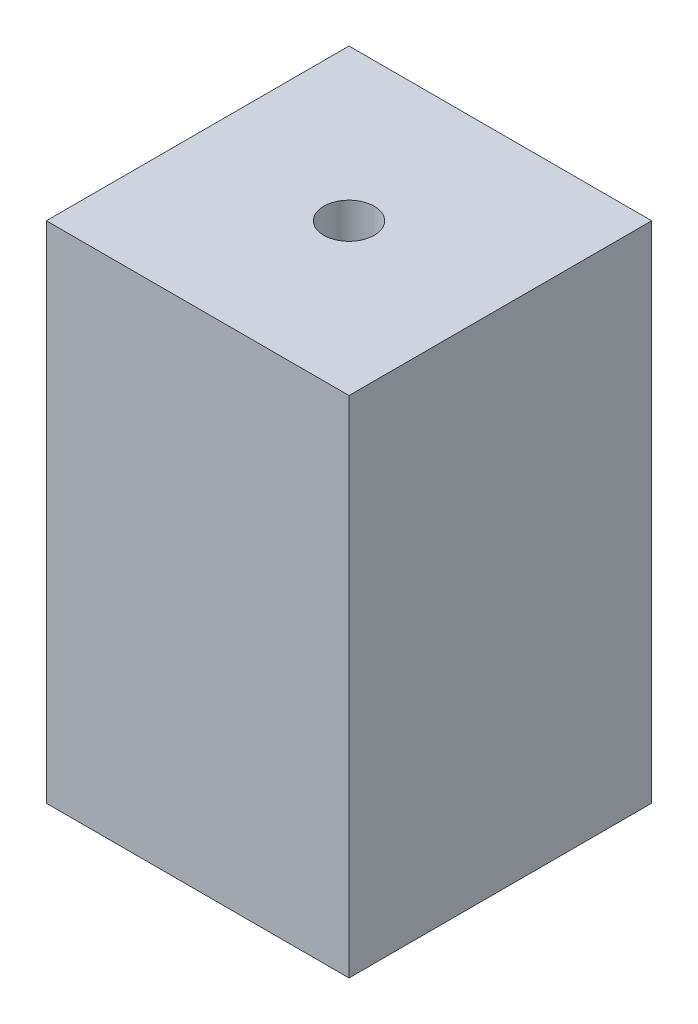
ISO-10303-21;
HEADER;
FILE_DESCRIPTION(('STEP AP214'),'2;1');
FILE_NAME('part.step','',(''),(''),'','','');
FILE_SCHEMA(('AUTOMOTIVE_DESIGN { 1 0 10303 214 1 1 1 1 }'));
ENDSEC;
DATA;
#1=APPLICATION_CONTEXT('core data for automotive mechanical design processes');
#2=APPLICATION_PROTOCOL_DEFINITION('international standard','automotive_design',2000,#1);
#3=PRODUCT_CONTEXT('',#1,'mechanical');
#4=PRODUCT('Part','Part','',(#3));
#5=PRODUCT_RELATED_PRODUCT_CATEGORY('part','',(#4));
#6=PRODUCT_DEFINITION_FORMATION('','',#4);
#7=PRODUCT_DEFINITION_CONTEXT('part definition',#1,'design');
#8=PRODUCT_DEFINITION('design','',#6,#7);
#9=PRODUCT_DEFINITION_SHAPE('','',#8);
#10=(LENGTH_UNIT() NAMED_UNIT(*) SI_UNIT(.MILLI.,.METRE.));
#11=(NAMED_UNIT(*) PLANE_ANGLE_UNIT() SI_UNIT($,.RADIAN.));
#12=(NAMED_UNIT(*) SI_UNIT($,.STERADIAN.) SOLID_ANGLE_UNIT());
#13=UNCERTAINTY_MEASURE_WITH_UNIT(LENGTH_MEASURE(1.E-05),#10,'distance_accuracy_value','');
#14=(GEOMETRIC_REPRESENTATION_CONTEXT(3) GLOBAL_UNCERTAINTY_ASSIGNED_CONTEXT((#13)) GLOBAL_UNIT_ASSIGNED_CONTEXT((#10,
#11,#12)) REPRESENTATION_CONTEXT('',''));
#15=CARTESIAN_POINT('',(0.,0.,0.));
#16=DIRECTION('',(0.,0.,1.));
#17=DIRECTION('',(1.,0.,0.));
#18=AXIS2_PLACEMENT_3D('',#15,#16,#17);
#19=CARTESIAN_POINT('',(15.,50.,-15.));
#20=DIRECTION('',(-1.,0.,0.));
#21=DIRECTION('',(0.,0.,1.));
#22=AXIS2_PLACEMENT_3D('',#19,#20,#21);
#23=PLANE('',#22);
#24=DIRECTION('',(0.,0.,-1.));
#25=VECTOR('',#24,1.);
#26=CARTESIAN_POINT('',(15.,0.,-15.));
#27=LINE('',#26,#25);
#28=CARTESIAN_POINT('',(15.,0.,15.));
#29=VERTEX_POINT('',#28);
#30=CARTESIAN_POINT('',(15.,0.,-15.));
#31=VERTEX_POINT('',#30);
#32=EDGE_CURVE('E107',#29,#31,#27,.T.);
#33=ORIENTED_EDGE('',*,*,#32,.T.);
#34=DIRECTION('',(0.,-1.,0.));
#35=VECTOR('',#34,1.);
#36=CARTESIAN_POINT('',(15.,50.,-15.));
#37=LINE('',#36,#35);
#38=CARTESIAN_POINT('',(15.,50.,-15.));
#39=VERTEX_POINT('',#38);
#40=EDGE_CURVE('E11',#39,#31,#37,.T.);
#41=ORIENTED_EDGE('',*,*,#40,.F.);
#42=DIRECTION('',(0.,0.,-1.));
#43=VECTOR('',#42,1.);
#44=CARTESIAN_POINT('',(15.,50.,-15.));
#45=LINE('',#44,#43);
#46=CARTESIAN_POINT('',(15.,50.,15.));
#47=VERTEX_POINT('',#46);
#48=EDGE_CURVE('E91',#47,#39,#45,.T.);
#49=ORIENTED_EDGE('',*,*,#48,.F.);
#50=DIRECTION('',(0.,-1.,0.));
#51=VECTOR('',#50,1.);
#52=CARTESIAN_POINT('',(15.,50.,15.));
#53=LINE('',#52,#51);
#54=EDGE_CURVE('E103',#47,#29,#53,.T.);
#55=ORIENTED_EDGE('',*,*,#54,.T.);
#56=EDGE_LOOP('',(#33,#41,#49,#55));
#57=FACE_BOUND('',#56,.T.);
#58=ADVANCED_FACE('F39',(#57),#23,.F.);
#59=CARTESIAN_POINT('',(-15.,50.,-15.));
#60=DIRECTION('',(0.,0.,1.));
#61=DIRECTION('',(1.,0.,0.));
#62=AXIS2_PLACEMENT_3D('',#59,#60,#61);
#63=PLANE('',#62);
#64=DIRECTION('',(-1.,0.,0.));
#65=VECTOR('',#64,1.);
#66=CARTESIAN_POINT('',(-15.,0.,-15.));
#67=LINE('',#66,#65);
#68=CARTESIAN_POINT('',(-15.,0.,-15.));
#69=VERTEX_POINT('',#68);
#70=EDGE_CURVE('E96',#31,#69,#67,.T.);
#71=ORIENTED_EDGE('',*,*,#70,.T.);
#72=DIRECTION('',(0.,-1.,0.));
#73=VECTOR('',#72,1.);
#74=CARTESIAN_POINT('',(-15.,50.,-15.));
#75=LINE('',#74,#73);
#76=CARTESIAN_POINT('',(-15.,50.,-15.));
#77=VERTEX_POINT('',#76);
#78=EDGE_CURVE('E48',#77,#69,#75,.T.);
#79=ORIENTED_EDGE('',*,*,#78,.F.);
#80=DIRECTION('',(-1.,0.,0.));
#81=VECTOR('',#80,1.);
#82=CARTESIAN_POINT('',(-15.,50.,-15.));
#83=LINE('',#82,#81);
#84=EDGE_CURVE('E86',#39,#77,#83,.T.);
#85=ORIENTED_EDGE('',*,*,#84,.F.);
#86=ORIENTED_EDGE('',*,*,#40,.T.);
#87=EDGE_LOOP('',(#71,#79,#85,#86));
#88=FACE_BOUND('',#87,.T.);
#89=ADVANCED_FACE('F95',(#88),#63,.F.);
#90=CARTESIAN_POINT('',(-15.,50.,-15.));
#91=DIRECTION('',(1.,0.,0.));
#92=DIRECTION('',(0.,0.,-1.));
#93=AXIS2_PLACEMENT_3D('',#90,#91,#92);
#94=PLANE('',#93);
#95=DIRECTION('',(0.,0.,1.));
#96=VECTOR('',#95,1.);
#97=CARTESIAN_POINT('',(-15.,0.,-15.));
#98=LINE('',#97,#96);
#99=CARTESIAN_POINT('',(-15.,0.,15.));
#100=VERTEX_POINT('',#99);
#101=EDGE_CURVE('E73',#69,#100,#98,.T.);
#102=ORIENTED_EDGE('',*,*,#101,.T.);
#103=DIRECTION('',(0.,-1.,0.));
#104=VECTOR('',#103,1.);
#105=CARTESIAN_POINT('',(-15.,50.,15.));
#106=LINE('',#105,#104);
#107=CARTESIAN_POINT('',(-15.,50.,15.));
#108=VERTEX_POINT('',#107);
#109=EDGE_CURVE('E98',#108,#100,#106,.T.);
#110=ORIENTED_EDGE('',*,*,#109,.F.);
#111=DIRECTION('',(0.,0.,1.));
#112=VECTOR('',#111,1.);
#113=CARTESIAN_POINT('',(-15.,50.,-15.));
#114=LINE('',#113,#112);
#115=EDGE_CURVE('E89',#77,#108,#114,.T.);
#116=ORIENTED_EDGE('',*,*,#115,.F.);
#117=ORIENTED_EDGE('',*,*,#78,.T.);
#118=EDGE_LOOP('',(#102,#110,#116,#117));
#119=FACE_BOUND('',#118,.T.);
#120=ADVANCED_FACE('F99',(#119),#94,.F.);
#121=CARTESIAN_POINT('',(-15.,50.,15.));
#122=DIRECTION('',(0.,0.,-1.));
#123=DIRECTION('',(-1.,0.,0.));
#124=AXIS2_PLACEMENT_3D('',#121,#122,#123);
#125=PLANE('',#124);
#126=DIRECTION('',(1.,0.,0.));
#127=VECTOR('',#126,1.);
#128=CARTESIAN_POINT('',(-15.,0.,15.));
#129=LINE('',#128,#127);
#130=EDGE_CURVE('E79',#100,#29,#129,.T.);
#131=ORIENTED_EDGE('',*,*,#130,.T.);
#132=ORIENTED_EDGE('',*,*,#54,.F.);
#133=DIRECTION('',(1.,0.,0.));
#134=VECTOR('',#133,1.);
#135=CARTESIAN_POINT('',(-15.,50.,15.));
#136=LINE('',#135,#134);
#137=EDGE_CURVE('E56',#108,#47,#136,.T.);
#138=ORIENTED_EDGE('',*,*,#137,.F.);
#139=ORIENTED_EDGE('',*,*,#109,.T.);
#140=EDGE_LOOP('',(#131,#132,#138,#139));
#141=FACE_BOUND('',#140,.T.);
#142=ADVANCED_FACE('F121',(#141),#125,.F.);
#143=CARTESIAN_POINT('',(0.,50.,0.));
#144=DIRECTION('',(0.,1.,0.));
#145=DIRECTION('',(0.,0.,1.));
#146=AXIS2_PLACEMENT_3D('',#143,#144,#145);
#147=PLANE('',#146);
#148=CARTESIAN_POINT('',(0.,50.,0.));
#149=DIRECTION('',(0.,1.,0.));
#150=DIRECTION('',(0.,0.,1.));
#151=AXIS2_PLACEMENT_3D('',#148,#149,#150);
#152=CIRCLE('',#151,2.5);
#153=CARTESIAN_POINT('',(0.,50.,2.5));
#154=VERTEX_POINT('',#153);
#155=EDGE_CURVE('E128',#154,#154,#152,.T.);
#156=ORIENTED_EDGE('',*,*,#155,.F.);
#157=EDGE_LOOP('',(#156));
#158=FACE_BOUND('',#157,.T.);
#159=ORIENTED_EDGE('',*,*,#48,.T.);
#160=ORIENTED_EDGE('',*,*,#84,.T.);
#161=ORIENTED_EDGE('',*,*,#115,.T.);
#162=ORIENTED_EDGE('',*,*,#137,.T.);
#163=EDGE_LOOP('',(#159,#160,#161,#162));
#164=FACE_BOUND('',#163,.T.);
#165=ADVANCED_FACE('F87',(#158,#164),#147,.T.);
#166=CARTESIAN_POINT('',(0.,0.,0.));
#167=DIRECTION('',(0.,1.,0.));
#168=DIRECTION('',(0.,0.,1.));
#169=AXIS2_PLACEMENT_3D('',#166,#167,#168);
#170=PLANE('',#169);
#171=ORIENTED_EDGE('',*,*,#32,.F.);
#172=ORIENTED_EDGE('',*,*,#130,.F.);
#173=ORIENTED_EDGE('',*,*,#101,.F.);
#174=ORIENTED_EDGE('',*,*,#70,.F.);
#175=EDGE_LOOP('',(#171,#172,#173,#174));
#176=FACE_BOUND('',#175,.T.);
#177=ADVANCED_FACE('F124',(#176),#170,.F.);
#178=CARTESIAN_POINT('',(0.,40.,0.));
#179=DIRECTION('',(0.,1.,0.));
#180=DIRECTION('',(0.,0.,1.));
#181=AXIS2_PLACEMENT_3D('',#178,#179,#180);
#182=CYLINDRICAL_SURFACE('',#181,2.5);
#183=CARTESIAN_POINT('',(0.,40.,0.));
#184=DIRECTION('',(0.,1.,0.));
#185=DIRECTION('',(0.,0.,1.));
#186=AXIS2_PLACEMENT_3D('',#183,#184,#185);
#187=CIRCLE('',#186,2.5);
#188=CARTESIAN_POINT('',(0.,40.,2.5));
#189=VERTEX_POINT('',#188);
#190=EDGE_CURVE('E111',#189,#189,#187,.T.);
#191=ORIENTED_EDGE('',*,*,#190,.F.);
#192=EDGE_LOOP('',(#191));
#193=FACE_BOUND('',#192,.T.);
#194=ORIENTED_EDGE('',*,*,#155,.T.);
#195=EDGE_LOOP('',(#194));
#196=FACE_BOUND('',#195,.T.);
#197=ADVANCED_FACE('F138',(#193,#196),#182,.F.);
#198=CARTESIAN_POINT('',(0.,40.,0.));
#199=DIRECTION('',(0.,1.,0.));
#200=DIRECTION('',(0.,0.,1.));
#201=AXIS2_PLACEMENT_3D('',#198,#199,#200);
#202=PLANE('',#201);
#203=ORIENTED_EDGE('',*,*,#190,.T.);
#204=EDGE_LOOP('',(#203));
#205=FACE_BOUND('',#204,.T.);
#206=ADVANCED_FACE('F136',(#205),#202,.T.);
#207=CLOSED_SHELL('',(#58,#89,#120,#142,#165,#177,#197,#206));
#208=MANIFOLD_SOLID_BREP('B2',#207);
#209=ADVANCED_BREP_SHAPE_REPRESENTATION('',(#18,#208),#14);
#210=SHAPE_DEFINITION_REPRESENTATION(#9,#209);
ENDSEC;
END-ISO-10303-21;
